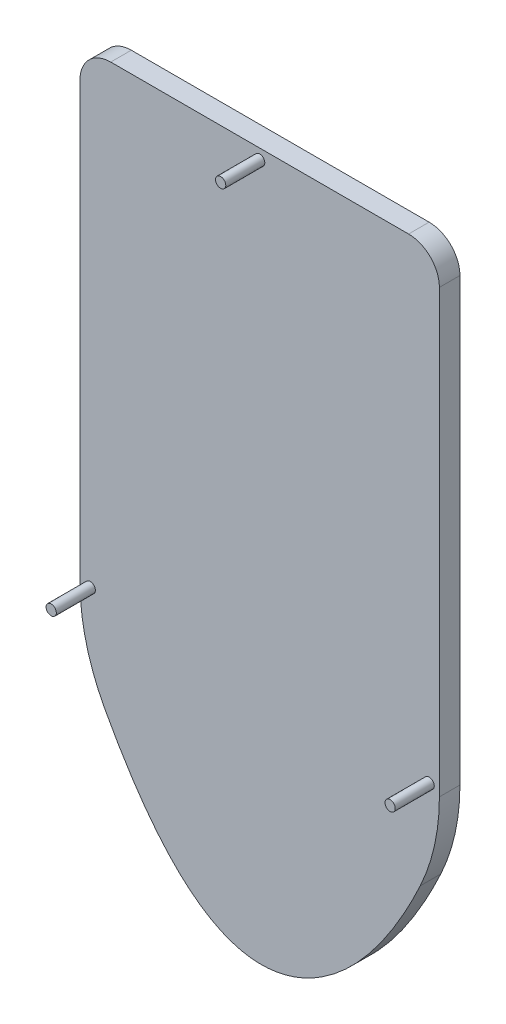
ISO-10303-21;
HEADER;
FILE_DESCRIPTION(('STEP AP214'),'2;1');
FILE_NAME('part.step','',(''),(''),'','','');
FILE_SCHEMA(('AUTOMOTIVE_DESIGN { 1 0 10303 214 1 1 1 1 }'));
ENDSEC;
DATA;
#1=APPLICATION_CONTEXT('core data for automotive mechanical design processes');
#2=APPLICATION_PROTOCOL_DEFINITION('international standard','automotive_design',2000,#1);
#3=PRODUCT_CONTEXT('',#1,'mechanical');
#4=PRODUCT('Part','Part','',(#3));
#5=PRODUCT_RELATED_PRODUCT_CATEGORY('part','',(#4));
#6=PRODUCT_DEFINITION_FORMATION('','',#4);
#7=PRODUCT_DEFINITION_CONTEXT('part definition',#1,'design');
#8=PRODUCT_DEFINITION('design','',#6,#7);
#9=PRODUCT_DEFINITION_SHAPE('','',#8);
#10=(LENGTH_UNIT() NAMED_UNIT(*) SI_UNIT(.MILLI.,.METRE.));
#11=(NAMED_UNIT(*) PLANE_ANGLE_UNIT() SI_UNIT($,.RADIAN.));
#12=(NAMED_UNIT(*) SI_UNIT($,.STERADIAN.) SOLID_ANGLE_UNIT());
#13=UNCERTAINTY_MEASURE_WITH_UNIT(LENGTH_MEASURE(1.E-05),#10,'distance_accuracy_value','');
#14=(GEOMETRIC_REPRESENTATION_CONTEXT(3) GLOBAL_UNCERTAINTY_ASSIGNED_CONTEXT((#13)) GLOBAL_UNIT_ASSIGNED_CONTEXT((#10,
#11,#12)) REPRESENTATION_CONTEXT('',''));
#15=CARTESIAN_POINT('',(0.,0.,0.));
#16=DIRECTION('',(0.,0.,1.));
#17=DIRECTION('',(1.,0.,0.));
#18=AXIS2_PLACEMENT_3D('',#15,#16,#17);
#19=CARTESIAN_POINT('',(7.77135416694578,-27.8500686154927,0.));
#20=DIRECTION('',(1.,0.,0.));
#21=DIRECTION('',(0.,1.,0.));
#22=AXIS2_PLACEMENT_3D('',#19,#20,#21);
#23=PLANE('',#22);
#24=DIRECTION('',(0.,1.,0.));
#25=VECTOR('',#24,1.);
#26=CARTESIAN_POINT('',(7.77135416694578,-27.8500686154927,2.));
#27=LINE('',#26,#25);
#28=CARTESIAN_POINT('',(7.77135416694576,-23.4249819257392,2.));
#29=VERTEX_POINT('',#28);
#30=CARTESIAN_POINT('',(7.77135416694566,19.5408322593714,2.));
#31=VERTEX_POINT('',#30);
#32=EDGE_CURVE('E99',#29,#31,#27,.T.);
#33=ORIENTED_EDGE('',*,*,#32,.F.);
#34=DIRECTION('',(0.,0.,1.));
#35=VECTOR('',#34,1.);
#36=CARTESIAN_POINT('',(7.77135416694576,-23.4249819257392,0.));
#37=LINE('',#36,#35);
#38=CARTESIAN_POINT('',(7.77135416694576,-23.4249819257392,0.));
#39=VERTEX_POINT('',#38);
#40=EDGE_CURVE('E56',#29,#39,#37,.F.);
#41=ORIENTED_EDGE('',*,*,#40,.T.);
#42=DIRECTION('',(0.,1.,0.));
#43=VECTOR('',#42,1.);
#44=CARTESIAN_POINT('',(7.77135416694578,-27.8500686154927,0.));
#45=LINE('',#44,#43);
#46=CARTESIAN_POINT('',(7.77135416694566,19.5408322593714,0.));
#47=VERTEX_POINT('',#46);
#48=EDGE_CURVE('E121',#39,#47,#45,.T.);
#49=ORIENTED_EDGE('',*,*,#48,.T.);
#50=DIRECTION('',(0.,0.,1.));
#51=VECTOR('',#50,1.);
#52=CARTESIAN_POINT('',(7.77135416694566,19.5408322593714,0.));
#53=LINE('',#52,#51);
#54=EDGE_CURVE('E116',#47,#31,#53,.T.);
#55=ORIENTED_EDGE('',*,*,#54,.T.);
#56=EDGE_LOOP('',(#33,#41,#49,#55));
#57=FACE_BOUND('',#56,.T.);
#58=ADVANCED_FACE('F33',(#57),#23,.T.);
#59=CARTESIAN_POINT('',(-27.2286458330543,-27.8130673917641,0.));
#60=CARTESIAN_POINT('',(-26.4278734860567,-29.2958205397484,0.));
#61=CARTESIAN_POINT('',(-25.627101139059,-30.7785736877327,0.));
#62=CARTESIAN_POINT('',(-24.8263287920613,-32.261326835717,0.));
#63=CARTESIAN_POINT('',(-22.2923671829877,-36.9533464425532,0.));
#64=CARTESIAN_POINT('',(-19.783595238604,-40.462251889738,0.));
#65=CARTESIAN_POINT('',(-14.784556662481,-45.0470145759184,0.));
#66=CARTESIAN_POINT('',(-9.63803854603605,-47.4223024953741,0.));
#67=CARTESIAN_POINT('',(-4.15307493297019,-45.0718280451644,0.));
#68=CARTESIAN_POINT('',(1.18071977441696,-40.1949741228487,0.));
#69=CARTESIAN_POINT('',(3.68987915278628,-36.6220382483889,0.));
#70=CARTESIAN_POINT('',(5.90459910344876,-31.8621276559725,0.));
#71=CARTESIAN_POINT('',(6.5268507912811,-30.5247746424793,0.));
#72=CARTESIAN_POINT('',(7.14910247911344,-29.187421628986,0.));
#73=CARTESIAN_POINT('',(7.77135416694578,-27.8500686154927,0.));
#74=B_SPLINE_CURVE_WITH_KNOTS('',3,(#59,#60,#61,#62,#63,#64,#65,#66,#67,#68,#69,#70,#71,#72,
#73),.UNSPECIFIED.,.F.,.F.,(4,3,2,1,2,3,4),(-7.20538212428679E-13,0.0686376297418599,
0.285834339090785,0.496242407368661,0.721002108525863,0.937653652631564,0.998524458870939),.UNSPECIFIED.);
#75=DIRECTION('',(0.,0.,1.));
#76=VECTOR('',#75,1.);
#77=SURFACE_OF_LINEAR_EXTRUSION('',#74,#76);
#78=CARTESIAN_POINT('',(-24.8263287920613,-32.261326835717,0.));
#79=VERTEX_POINT('',#78);
#80=CARTESIAN_POINT('',(5.90459910344876,-31.8621276559725,0.));
#81=VERTEX_POINT('',#80);
#82=EDGE_CURVE('E123',#79,#81,#74,.T.);
#83=ORIENTED_EDGE('',*,*,#82,.T.);
#84=DIRECTION('',(0.,0.,1.));
#85=VECTOR('',#84,1.);
#86=CARTESIAN_POINT('',(5.90459910344876,-31.8621276559725,0.));
#87=LINE('',#86,#85);
#88=CARTESIAN_POINT('',(5.90459910344876,-31.8621276559725,2.));
#89=VERTEX_POINT('',#88);
#90=EDGE_CURVE('E146',#81,#89,#87,.T.);
#91=ORIENTED_EDGE('',*,*,#90,.T.);
#92=CARTESIAN_POINT('',(-27.2286458330543,-27.8130673917641,2.));
#93=CARTESIAN_POINT('',(-26.4278734860567,-29.2958205397484,2.));
#94=CARTESIAN_POINT('',(-25.627101139059,-30.7785736877327,2.));
#95=CARTESIAN_POINT('',(-24.8263287920613,-32.261326835717,2.));
#96=CARTESIAN_POINT('',(-19.8376063864097,-41.4987135650833,2.));
#97=CARTESIAN_POINT('',(-9.89750648111136,-50.9522882785028,2.));
#98=CARTESIAN_POINT('',(1.39227358384127,-41.5600879018202,2.));
#99=CARTESIAN_POINT('',(5.90459910344876,-31.8621276559725,2.));
#100=CARTESIAN_POINT('',(6.5268507912811,-30.5247746424793,2.));
#101=CARTESIAN_POINT('',(7.14910247911344,-29.187421628986,2.));
#102=CARTESIAN_POINT('',(7.77135416694578,-27.8500686154927,2.));
#103=B_SPLINE_CURVE_WITH_KNOTS('',3,(#92,#93,#94,#95,#96,#97,#98,#99,#100,#101,#102),
.UNSPECIFIED.,.F.,.F.,(4,3,1,3,4),(-7.20538212428679E-13,0.0686376297418599,0.496242407368661,
0.937653652631564,0.998524458870939),.UNSPECIFIED.);
#104=CARTESIAN_POINT('',(-24.8263287920613,-32.261326835717,2.));
#105=VERTEX_POINT('',#104);
#106=EDGE_CURVE('E130',#105,#89,#103,.T.);
#107=ORIENTED_EDGE('',*,*,#106,.F.);
#108=DIRECTION('',(0.,0.,1.));
#109=VECTOR('',#108,1.);
#110=CARTESIAN_POINT('',(-24.8263287920613,-32.261326835717,2.));
#111=LINE('',#110,#109);
#112=EDGE_CURVE('E144',#105,#79,#111,.F.);
#113=ORIENTED_EDGE('',*,*,#112,.T.);
#114=EDGE_LOOP('',(#83,#91,#107,#113));
#115=FACE_BOUND('',#114,.T.);
#116=ADVANCED_FACE('F158',(#115),#77,.T.);
#117=CARTESIAN_POINT('',(-27.2286458330544,22.5408322593714,0.));
#118=DIRECTION('',(-1.,0.,0.));
#119=DIRECTION('',(0.,-1.,0.));
#120=AXIS2_PLACEMENT_3D('',#117,#118,#119);
#121=PLANE('',#120);
#122=DIRECTION('',(0.,-1.,0.));
#123=VECTOR('',#122,1.);
#124=CARTESIAN_POINT('',(-27.2286458330544,22.5408322593714,0.));
#125=LINE('',#124,#123);
#126=CARTESIAN_POINT('',(-27.2286458330544,19.5408322593714,0.));
#127=VERTEX_POINT('',#126);
#128=CARTESIAN_POINT('',(-27.2286458330543,-22.7575615569407,0.));
#129=VERTEX_POINT('',#128);
#130=EDGE_CURVE('E127',#127,#129,#125,.T.);
#131=ORIENTED_EDGE('',*,*,#130,.T.);
#132=DIRECTION('',(0.,0.,1.));
#133=VECTOR('',#132,1.);
#134=CARTESIAN_POINT('',(-27.2286458330543,-22.7575615569407,0.));
#135=LINE('',#134,#133);
#136=CARTESIAN_POINT('',(-27.2286458330543,-22.7575615569407,2.));
#137=VERTEX_POINT('',#136);
#138=EDGE_CURVE('E11',#129,#137,#135,.T.);
#139=ORIENTED_EDGE('',*,*,#138,.T.);
#140=DIRECTION('',(0.,-1.,0.));
#141=VECTOR('',#140,1.);
#142=CARTESIAN_POINT('',(-27.2286458330544,22.5408322593714,2.));
#143=LINE('',#142,#141);
#144=CARTESIAN_POINT('',(-27.2286458330544,19.5408322593714,2.));
#145=VERTEX_POINT('',#144);
#146=EDGE_CURVE('E226',#145,#137,#143,.T.);
#147=ORIENTED_EDGE('',*,*,#146,.F.);
#148=DIRECTION('',(0.,0.,1.));
#149=VECTOR('',#148,1.);
#150=CARTESIAN_POINT('',(-27.2286458330544,19.5408322593714,0.));
#151=LINE('',#150,#149);
#152=EDGE_CURVE('E142',#145,#127,#151,.F.);
#153=ORIENTED_EDGE('',*,*,#152,.T.);
#154=EDGE_LOOP('',(#131,#139,#147,#153));
#155=FACE_BOUND('',#154,.T.);
#156=ADVANCED_FACE('F176',(#155),#121,.T.);
#157=CARTESIAN_POINT('',(7.77135416694565,22.5408322593714,0.));
#158=DIRECTION('',(0.,1.,0.));
#159=DIRECTION('',(0.,0.,1.));
#160=AXIS2_PLACEMENT_3D('',#157,#158,#159);
#161=PLANE('',#160);
#162=DIRECTION('',(-1.,0.,0.));
#163=VECTOR('',#162,1.);
#164=CARTESIAN_POINT('',(7.77135416694565,22.5408322593714,2.));
#165=LINE('',#164,#163);
#166=CARTESIAN_POINT('',(4.77135416694566,22.5408322593714,2.));
#167=VERTEX_POINT('',#166);
#168=CARTESIAN_POINT('',(-24.2286458330544,22.5408322593714,2.));
#169=VERTEX_POINT('',#168);
#170=EDGE_CURVE('E108',#167,#169,#165,.T.);
#171=ORIENTED_EDGE('',*,*,#170,.F.);
#172=DIRECTION('',(0.,0.,1.));
#173=VECTOR('',#172,1.);
#174=CARTESIAN_POINT('',(4.77135416694566,22.5408322593714,0.));
#175=LINE('',#174,#173);
#176=CARTESIAN_POINT('',(4.77135416694566,22.5408322593714,0.));
#177=VERTEX_POINT('',#176);
#178=EDGE_CURVE('E117',#167,#177,#175,.F.);
#179=ORIENTED_EDGE('',*,*,#178,.T.);
#180=DIRECTION('',(-1.,0.,0.));
#181=VECTOR('',#180,1.);
#182=CARTESIAN_POINT('',(7.77135416694565,22.5408322593714,0.));
#183=LINE('',#182,#181);
#184=CARTESIAN_POINT('',(-24.2286458330544,22.5408322593714,0.));
#185=VERTEX_POINT('',#184);
#186=EDGE_CURVE('E229',#177,#185,#183,.T.);
#187=ORIENTED_EDGE('',*,*,#186,.T.);
#188=DIRECTION('',(0.,0.,1.));
#189=VECTOR('',#188,1.);
#190=CARTESIAN_POINT('',(-24.2286458330544,22.5408322593714,0.));
#191=LINE('',#190,#189);
#192=EDGE_CURVE('E118',#185,#169,#191,.T.);
#193=ORIENTED_EDGE('',*,*,#192,.T.);
#194=EDGE_LOOP('',(#171,#179,#187,#193));
#195=FACE_BOUND('',#194,.T.);
#196=ADVANCED_FACE('F180',(#195),#161,.T.);
#197=CARTESIAN_POINT('',(-9.61804877911301,-46.2403655921621,0.));
#198=DIRECTION('',(0.,0.,-1.));
#199=DIRECTION('',(-1.,0.,0.));
#200=AXIS2_PLACEMENT_3D('',#197,#198,#199);
#201=PLANE('',#200);
#202=ORIENTED_EDGE('',*,*,#48,.F.);
#203=CARTESIAN_POINT('',(-12.2286458330431,-23.4249819257393,0.));
#204=DIRECTION('',(0.,0.,-1.));
#205=DIRECTION('',(-1.,0.,0.));
#206=AXIS2_PLACEMENT_3D('',#203,#204,#205);
#207=CIRCLE('',#206,20.);
#208=EDGE_CURVE('E41',#39,#81,#207,.T.);
#209=ORIENTED_EDGE('',*,*,#208,.T.);
#210=ORIENTED_EDGE('',*,*,#82,.F.);
#211=CARTESIAN_POINT('',(-7.22864583304294,-22.7575615569407,0.));
#212=DIRECTION('',(0.,0.,-1.));
#213=DIRECTION('',(-1.,0.,0.));
#214=AXIS2_PLACEMENT_3D('',#211,#212,#213);
#215=CIRCLE('',#214,20.);
#216=EDGE_CURVE('E48',#79,#129,#215,.T.);
#217=ORIENTED_EDGE('',*,*,#216,.T.);
#218=ORIENTED_EDGE('',*,*,#130,.F.);
#219=CARTESIAN_POINT('',(-24.2286458330544,19.5408322593714,0.));
#220=DIRECTION('',(0.,0.,-1.));
#221=DIRECTION('',(-1.,0.,0.));
#222=AXIS2_PLACEMENT_3D('',#219,#220,#221);
#223=CIRCLE('',#222,3.);
#224=EDGE_CURVE('E138',#127,#185,#223,.T.);
#225=ORIENTED_EDGE('',*,*,#224,.T.);
#226=ORIENTED_EDGE('',*,*,#186,.F.);
#227=CARTESIAN_POINT('',(4.77135416694566,19.5408322593714,0.));
#228=DIRECTION('',(0.,0.,-1.));
#229=DIRECTION('',(-1.,0.,0.));
#230=AXIS2_PLACEMENT_3D('',#227,#228,#229);
#231=CIRCLE('',#230,3.);
#232=EDGE_CURVE('E140',#177,#47,#231,.T.);
#233=ORIENTED_EDGE('',*,*,#232,.T.);
#234=EDGE_LOOP('',(#202,#209,#210,#217,#218,#225,#226,#233));
#235=FACE_BOUND('',#234,.T.);
#236=ADVANCED_FACE('F154',(#235),#201,.T.);
#237=CARTESIAN_POINT('',(-9.61804877911301,-46.2403655921621,2.));
#238=DIRECTION('',(0.,0.,-1.));
#239=DIRECTION('',(-1.,0.,0.));
#240=AXIS2_PLACEMENT_3D('',#237,#238,#239);
#241=PLANE('',#240);
#242=CARTESIAN_POINT('',(-9.72864583305435,21.5408322593713,2.));
#243=DIRECTION('',(0.,0.,-1.));
#244=DIRECTION('',(-1.,0.,0.));
#245=AXIS2_PLACEMENT_3D('',#242,#243,#244);
#246=CIRCLE('',#245,0.5);
#247=CARTESIAN_POINT('',(-10.2286458330544,21.5408322593713,2.));
#248=VERTEX_POINT('',#247);
#249=EDGE_CURVE('E247',#248,#248,#246,.T.);
#250=ORIENTED_EDGE('',*,*,#249,.T.);
#251=EDGE_LOOP('',(#250));
#252=FACE_BOUND('',#251,.T.);
#253=CARTESIAN_POINT('',(-26.2286458330544,-22.7575615569544,2.));
#254=DIRECTION('',(0.,0.,-1.));
#255=DIRECTION('',(-1.,0.,0.));
#256=AXIS2_PLACEMENT_3D('',#253,#254,#255);
#257=CIRCLE('',#256,0.5);
#258=CARTESIAN_POINT('',(-26.7286458330544,-22.7575615569544,2.));
#259=VERTEX_POINT('',#258);
#260=EDGE_CURVE('E241',#259,#259,#257,.T.);
#261=ORIENTED_EDGE('',*,*,#260,.T.);
#262=EDGE_LOOP('',(#261));
#263=FACE_BOUND('',#262,.T.);
#264=CARTESIAN_POINT('',(6.77135416694567,-22.7575615569544,2.));
#265=DIRECTION('',(0.,0.,-1.));
#266=DIRECTION('',(-1.,0.,0.));
#267=AXIS2_PLACEMENT_3D('',#264,#265,#266);
#268=CIRCLE('',#267,0.5);
#269=CARTESIAN_POINT('',(6.27135416694567,-22.7575615569544,2.));
#270=VERTEX_POINT('',#269);
#271=EDGE_CURVE('E235',#270,#270,#268,.T.);
#272=ORIENTED_EDGE('',*,*,#271,.T.);
#273=EDGE_LOOP('',(#272));
#274=FACE_BOUND('',#273,.T.);
#275=ORIENTED_EDGE('',*,*,#106,.T.);
#276=CARTESIAN_POINT('',(-12.2286458330431,-23.4249819257393,2.));
#277=DIRECTION('',(0.,0.,-1.));
#278=DIRECTION('',(-1.,0.,0.));
#279=AXIS2_PLACEMENT_3D('',#276,#277,#278);
#280=CIRCLE('',#279,20.);
#281=EDGE_CURVE('E106',#89,#29,#280,.F.);
#282=ORIENTED_EDGE('',*,*,#281,.T.);
#283=ORIENTED_EDGE('',*,*,#32,.T.);
#284=CARTESIAN_POINT('',(4.77135416694566,19.5408322593714,2.));
#285=DIRECTION('',(0.,0.,-1.));
#286=DIRECTION('',(-1.,0.,0.));
#287=AXIS2_PLACEMENT_3D('',#284,#285,#286);
#288=CIRCLE('',#287,3.);
#289=EDGE_CURVE('E104',#31,#167,#288,.F.);
#290=ORIENTED_EDGE('',*,*,#289,.T.);
#291=ORIENTED_EDGE('',*,*,#170,.T.);
#292=CARTESIAN_POINT('',(-24.2286458330544,19.5408322593714,2.));
#293=DIRECTION('',(0.,0.,-1.));
#294=DIRECTION('',(-1.,0.,0.));
#295=AXIS2_PLACEMENT_3D('',#292,#293,#294);
#296=CIRCLE('',#295,3.);
#297=EDGE_CURVE('E119',#169,#145,#296,.F.);
#298=ORIENTED_EDGE('',*,*,#297,.T.);
#299=ORIENTED_EDGE('',*,*,#146,.T.);
#300=CARTESIAN_POINT('',(-7.22864583304294,-22.7575615569407,2.));
#301=DIRECTION('',(0.,0.,-1.));
#302=DIRECTION('',(-1.,0.,0.));
#303=AXIS2_PLACEMENT_3D('',#300,#301,#302);
#304=CIRCLE('',#303,20.);
#305=EDGE_CURVE('E149',#137,#105,#304,.F.);
#306=ORIENTED_EDGE('',*,*,#305,.T.);
#307=EDGE_LOOP('',(#275,#282,#283,#290,#291,#298,#299,#306));
#308=FACE_BOUND('',#307,.T.);
#309=ADVANCED_FACE('F102',(#252,#263,#274,#308),#241,.F.);
#310=CARTESIAN_POINT('',(6.77135416694567,-22.7575615569544,5.8));
#311=DIRECTION('',(0.,0.,-1.));
#312=DIRECTION('',(-1.,0.,0.));
#313=AXIS2_PLACEMENT_3D('',#310,#311,#312);
#314=CYLINDRICAL_SURFACE('',#313,0.5);
#315=CARTESIAN_POINT('',(6.77135416694567,-22.7575615569544,5.8));
#316=DIRECTION('',(0.,0.,-1.));
#317=DIRECTION('',(-1.,0.,0.));
#318=AXIS2_PLACEMENT_3D('',#315,#316,#317);
#319=CIRCLE('',#318,0.5);
#320=CARTESIAN_POINT('',(6.27135416694567,-22.7575615569544,5.8));
#321=VERTEX_POINT('',#320);
#322=EDGE_CURVE('E109',#321,#321,#319,.T.);
#323=ORIENTED_EDGE('',*,*,#322,.T.);
#324=EDGE_LOOP('',(#323));
#325=FACE_BOUND('',#324,.T.);
#326=ORIENTED_EDGE('',*,*,#271,.F.);
#327=EDGE_LOOP('',(#326));
#328=FACE_BOUND('',#327,.T.);
#329=ADVANCED_FACE('F208',(#325,#328),#314,.T.);
#330=CARTESIAN_POINT('',(7.27135416694567,-22.7575615569544,5.8));
#331=DIRECTION('',(0.,0.,1.));
#332=DIRECTION('',(1.,0.,0.));
#333=AXIS2_PLACEMENT_3D('',#330,#331,#332);
#334=PLANE('',#333);
#335=ORIENTED_EDGE('',*,*,#322,.F.);
#336=EDGE_LOOP('',(#335));
#337=FACE_BOUND('',#336,.T.);
#338=ADVANCED_FACE('F204',(#337),#334,.T.);
#339=CARTESIAN_POINT('',(-26.2286458330544,-22.7575615569544,5.8));
#340=DIRECTION('',(0.,0.,-1.));
#341=DIRECTION('',(-1.,0.,0.));
#342=AXIS2_PLACEMENT_3D('',#339,#340,#341);
#343=CYLINDRICAL_SURFACE('',#342,0.5);
#344=CARTESIAN_POINT('',(-26.2286458330544,-22.7575615569544,5.8));
#345=DIRECTION('',(0.,0.,-1.));
#346=DIRECTION('',(-1.,0.,0.));
#347=AXIS2_PLACEMENT_3D('',#344,#345,#346);
#348=CIRCLE('',#347,0.5);
#349=CARTESIAN_POINT('',(-26.7286458330544,-22.7575615569544,5.8));
#350=VERTEX_POINT('',#349);
#351=EDGE_CURVE('E238',#350,#350,#348,.T.);
#352=ORIENTED_EDGE('',*,*,#351,.T.);
#353=EDGE_LOOP('',(#352));
#354=FACE_BOUND('',#353,.T.);
#355=ORIENTED_EDGE('',*,*,#260,.F.);
#356=EDGE_LOOP('',(#355));
#357=FACE_BOUND('',#356,.T.);
#358=ADVANCED_FACE('F200',(#354,#357),#343,.T.);
#359=CARTESIAN_POINT('',(-25.7286458330543,-22.7575615569544,5.8));
#360=DIRECTION('',(0.,0.,1.));
#361=DIRECTION('',(1.,0.,0.));
#362=AXIS2_PLACEMENT_3D('',#359,#360,#361);
#363=PLANE('',#362);
#364=ORIENTED_EDGE('',*,*,#351,.F.);
#365=EDGE_LOOP('',(#364));
#366=FACE_BOUND('',#365,.T.);
#367=ADVANCED_FACE('F193',(#366),#363,.T.);
#368=CARTESIAN_POINT('',(-9.72864583305435,21.5408322593713,5.8));
#369=DIRECTION('',(0.,0.,-1.));
#370=DIRECTION('',(-1.,0.,0.));
#371=AXIS2_PLACEMENT_3D('',#368,#369,#370);
#372=CYLINDRICAL_SURFACE('',#371,0.5);
#373=CARTESIAN_POINT('',(-9.72864583305435,21.5408322593713,5.8));
#374=DIRECTION('',(0.,0.,-1.));
#375=DIRECTION('',(-1.,0.,0.));
#376=AXIS2_PLACEMENT_3D('',#373,#374,#375);
#377=CIRCLE('',#376,0.5);
#378=CARTESIAN_POINT('',(-10.2286458330544,21.5408322593713,5.8));
#379=VERTEX_POINT('',#378);
#380=EDGE_CURVE('E244',#379,#379,#377,.T.);
#381=ORIENTED_EDGE('',*,*,#380,.T.);
#382=EDGE_LOOP('',(#381));
#383=FACE_BOUND('',#382,.T.);
#384=ORIENTED_EDGE('',*,*,#249,.F.);
#385=EDGE_LOOP('',(#384));
#386=FACE_BOUND('',#385,.T.);
#387=ADVANCED_FACE('F187',(#383,#386),#372,.T.);
#388=CARTESIAN_POINT('',(-9.22864583305435,21.5408322593713,5.8));
#389=DIRECTION('',(0.,0.,1.));
#390=DIRECTION('',(1.,0.,0.));
#391=AXIS2_PLACEMENT_3D('',#388,#389,#390);
#392=PLANE('',#391);
#393=ORIENTED_EDGE('',*,*,#380,.F.);
#394=EDGE_LOOP('',(#393));
#395=FACE_BOUND('',#394,.T.);
#396=ADVANCED_FACE('F183',(#395),#392,.T.);
#397=CARTESIAN_POINT('',(4.77135416694566,19.5408322593714,0.));
#398=DIRECTION('',(0.,0.,1.));
#399=DIRECTION('',(1.,0.,0.));
#400=AXIS2_PLACEMENT_3D('',#397,#398,#399);
#401=CYLINDRICAL_SURFACE('',#400,3.);
#402=ORIENTED_EDGE('',*,*,#232,.F.);
#403=ORIENTED_EDGE('',*,*,#178,.F.);
#404=ORIENTED_EDGE('',*,*,#289,.F.);
#405=ORIENTED_EDGE('',*,*,#54,.F.);
#406=EDGE_LOOP('',(#402,#403,#404,#405));
#407=FACE_BOUND('',#406,.T.);
#408=ADVANCED_FACE('F115',(#407),#401,.T.);
#409=CARTESIAN_POINT('',(-24.2286458330544,19.5408322593714,0.));
#410=DIRECTION('',(0.,0.,1.));
#411=DIRECTION('',(1.,0.,0.));
#412=AXIS2_PLACEMENT_3D('',#409,#410,#411);
#413=CYLINDRICAL_SURFACE('',#412,3.);
#414=ORIENTED_EDGE('',*,*,#224,.F.);
#415=ORIENTED_EDGE('',*,*,#152,.F.);
#416=ORIENTED_EDGE('',*,*,#297,.F.);
#417=ORIENTED_EDGE('',*,*,#192,.F.);
#418=EDGE_LOOP('',(#414,#415,#416,#417));
#419=FACE_BOUND('',#418,.T.);
#420=ADVANCED_FACE('F163',(#419),#413,.T.);
#421=CARTESIAN_POINT('',(-12.2286458330431,-23.4249819257393,1.));
#422=DIRECTION('',(0.,0.,1.));
#423=DIRECTION('',(1.,0.,0.));
#424=AXIS2_PLACEMENT_3D('',#421,#422,#423);
#425=CYLINDRICAL_SURFACE('',#424,20.);
#426=ORIENTED_EDGE('',*,*,#208,.F.);
#427=ORIENTED_EDGE('',*,*,#40,.F.);
#428=ORIENTED_EDGE('',*,*,#281,.F.);
#429=ORIENTED_EDGE('',*,*,#90,.F.);
#430=EDGE_LOOP('',(#426,#427,#428,#429));
#431=FACE_BOUND('',#430,.T.);
#432=ADVANCED_FACE('F161',(#431),#425,.T.);
#433=CARTESIAN_POINT('',(-7.22864583304294,-22.7575615569407,1.));
#434=DIRECTION('',(0.,0.,1.));
#435=DIRECTION('',(1.,0.,0.));
#436=AXIS2_PLACEMENT_3D('',#433,#434,#435);
#437=CYLINDRICAL_SURFACE('',#436,20.);
#438=ORIENTED_EDGE('',*,*,#216,.F.);
#439=ORIENTED_EDGE('',*,*,#112,.F.);
#440=ORIENTED_EDGE('',*,*,#305,.F.);
#441=ORIENTED_EDGE('',*,*,#138,.F.);
#442=EDGE_LOOP('',(#438,#439,#440,#441));
#443=FACE_BOUND('',#442,.T.);
#444=ADVANCED_FACE('F35',(#443),#437,.T.);
#445=CLOSED_SHELL('',(#58,#116,#156,#196,#236,#309,#329,#338,#358,#367,#387,#396,#408,#420,#432,#444));
#446=MANIFOLD_SOLID_BREP('B2',#445);
#447=ADVANCED_BREP_SHAPE_REPRESENTATION('',(#18,#446),#14);
#448=SHAPE_DEFINITION_REPRESENTATION(#9,#447);
ENDSEC;
END-ISO-10303-21;
